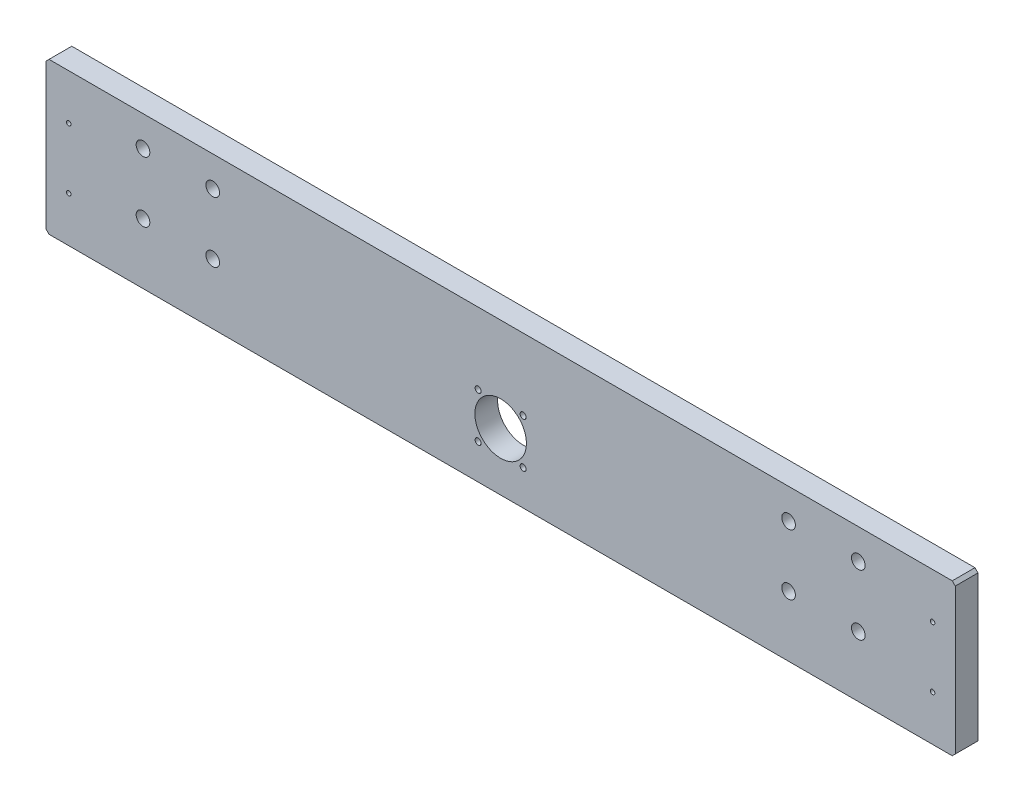
ISO-10303-21;
HEADER;
FILE_DESCRIPTION(('STEP AP214'),'2;1');
FILE_NAME('part.step','',(''),(''),'','','');
FILE_SCHEMA(('AUTOMOTIVE_DESIGN { 1 0 10303 214 1 1 1 1 }'));
ENDSEC;
DATA;
#1=APPLICATION_CONTEXT('core data for automotive mechanical design processes');
#2=APPLICATION_PROTOCOL_DEFINITION('international standard','automotive_design',2000,#1);
#3=PRODUCT_CONTEXT('',#1,'mechanical');
#4=PRODUCT('Part','Part','',(#3));
#5=PRODUCT_RELATED_PRODUCT_CATEGORY('part','',(#4));
#6=PRODUCT_DEFINITION_FORMATION('','',#4);
#7=PRODUCT_DEFINITION_CONTEXT('part definition',#1,'design');
#8=PRODUCT_DEFINITION('design','',#6,#7);
#9=PRODUCT_DEFINITION_SHAPE('','',#8);
#10=(LENGTH_UNIT() NAMED_UNIT(*) SI_UNIT(.MILLI.,.METRE.));
#11=(NAMED_UNIT(*) PLANE_ANGLE_UNIT() SI_UNIT($,.RADIAN.));
#12=(NAMED_UNIT(*) SI_UNIT($,.STERADIAN.) SOLID_ANGLE_UNIT());
#13=UNCERTAINTY_MEASURE_WITH_UNIT(LENGTH_MEASURE(1.E-05),#10,'distance_accuracy_value','');
#14=(GEOMETRIC_REPRESENTATION_CONTEXT(3) GLOBAL_UNCERTAINTY_ASSIGNED_CONTEXT((#13)) GLOBAL_UNIT_ASSIGNED_CONTEXT((#10,
#11,#12)) REPRESENTATION_CONTEXT('',''));
#15=CARTESIAN_POINT('',(0.,0.,0.));
#16=DIRECTION('',(0.,0.,1.));
#17=DIRECTION('',(1.,0.,0.));
#18=AXIS2_PLACEMENT_3D('',#15,#16,#17);
#19=CARTESIAN_POINT('',(0.,98.,-15.));
#20=DIRECTION('',(-0.707106781186548,0.707106781186547,0.));
#21=DIRECTION('',(-0.707106781186547,-0.707106781186548,0.));
#22=AXIS2_PLACEMENT_3D('',#19,#20,#21);
#23=PLANE('',#22);
#24=DIRECTION('',(-0.707106781186547,-0.707106781186548,0.));
#25=VECTOR('',#24,1.);
#26=CARTESIAN_POINT('',(0.,98.,0.));
#27=LINE('',#26,#25);
#28=CARTESIAN_POINT('',(2.,100.,0.));
#29=VERTEX_POINT('',#28);
#30=CARTESIAN_POINT('',(0.,98.,0.));
#31=VERTEX_POINT('',#30);
#32=EDGE_CURVE('E133',#29,#31,#27,.T.);
#33=ORIENTED_EDGE('',*,*,#32,.F.);
#34=DIRECTION('',(0.,0.,1.));
#35=VECTOR('',#34,1.);
#36=CARTESIAN_POINT('',(2.,100.,-15.));
#37=LINE('',#36,#35);
#38=CARTESIAN_POINT('',(2.,100.,-15.));
#39=VERTEX_POINT('',#38);
#40=EDGE_CURVE('E11',#39,#29,#37,.T.);
#41=ORIENTED_EDGE('',*,*,#40,.F.);
#42=DIRECTION('',(-0.707106781186547,-0.707106781186548,0.));
#43=VECTOR('',#42,1.);
#44=CARTESIAN_POINT('',(0.,98.,-15.));
#45=LINE('',#44,#43);
#46=CARTESIAN_POINT('',(0.,98.,-15.));
#47=VERTEX_POINT('',#46);
#48=EDGE_CURVE('E154',#39,#47,#45,.T.);
#49=ORIENTED_EDGE('',*,*,#48,.T.);
#50=DIRECTION('',(0.,0.,1.));
#51=VECTOR('',#50,1.);
#52=CARTESIAN_POINT('',(0.,98.,-15.));
#53=LINE('',#52,#51);
#54=EDGE_CURVE('E36',#47,#31,#53,.T.);
#55=ORIENTED_EDGE('',*,*,#54,.T.);
#56=EDGE_LOOP('',(#33,#41,#49,#55));
#57=FACE_BOUND('',#56,.T.);
#58=ADVANCED_FACE('F33',(#57),#23,.T.);
#59=CARTESIAN_POINT('',(2.,100.,-15.));
#60=DIRECTION('',(0.,1.,0.));
#61=DIRECTION('',(-1.,0.,0.));
#62=AXIS2_PLACEMENT_3D('',#59,#60,#61);
#63=PLANE('',#62);
#64=DIRECTION('',(-1.,0.,0.));
#65=VECTOR('',#64,1.);
#66=CARTESIAN_POINT('',(2.,100.,0.));
#67=LINE('',#66,#65);
#68=CARTESIAN_POINT('',(598.,100.,0.));
#69=VERTEX_POINT('',#68);
#70=EDGE_CURVE('E152',#69,#29,#67,.T.);
#71=ORIENTED_EDGE('',*,*,#70,.F.);
#72=DIRECTION('',(0.,0.,1.));
#73=VECTOR('',#72,1.);
#74=CARTESIAN_POINT('',(598.,100.,-15.));
#75=LINE('',#74,#73);
#76=CARTESIAN_POINT('',(598.,100.,-15.));
#77=VERTEX_POINT('',#76);
#78=EDGE_CURVE('E42',#77,#69,#75,.T.);
#79=ORIENTED_EDGE('',*,*,#78,.F.);
#80=DIRECTION('',(-1.,0.,0.));
#81=VECTOR('',#80,1.);
#82=CARTESIAN_POINT('',(2.,100.,-15.));
#83=LINE('',#82,#81);
#84=EDGE_CURVE('E123',#77,#39,#83,.T.);
#85=ORIENTED_EDGE('',*,*,#84,.T.);
#86=ORIENTED_EDGE('',*,*,#40,.T.);
#87=EDGE_LOOP('',(#71,#79,#85,#86));
#88=FACE_BOUND('',#87,.T.);
#89=ADVANCED_FACE('F166',(#88),#63,.T.);
#90=CARTESIAN_POINT('',(598.,100.,-15.));
#91=DIRECTION('',(0.70710678118654,0.707106781186555,0.));
#92=DIRECTION('',(-0.707106781186555,0.70710678118654,0.));
#93=AXIS2_PLACEMENT_3D('',#90,#91,#92);
#94=PLANE('',#93);
#95=DIRECTION('',(-0.707106781186555,0.70710678118654,0.));
#96=VECTOR('',#95,1.);
#97=CARTESIAN_POINT('',(598.,100.,0.));
#98=LINE('',#97,#96);
#99=CARTESIAN_POINT('',(600.,98.,0.));
#100=VERTEX_POINT('',#99);
#101=EDGE_CURVE('E110',#100,#69,#98,.T.);
#102=ORIENTED_EDGE('',*,*,#101,.F.);
#103=DIRECTION('',(0.,0.,1.));
#104=VECTOR('',#103,1.);
#105=CARTESIAN_POINT('',(600.,98.,-15.));
#106=LINE('',#105,#104);
#107=CARTESIAN_POINT('',(600.,98.,-15.));
#108=VERTEX_POINT('',#107);
#109=EDGE_CURVE('E105',#108,#100,#106,.T.);
#110=ORIENTED_EDGE('',*,*,#109,.F.);
#111=DIRECTION('',(-0.707106781186555,0.70710678118654,0.));
#112=VECTOR('',#111,1.);
#113=CARTESIAN_POINT('',(598.,100.,-15.));
#114=LINE('',#113,#112);
#115=EDGE_CURVE('E108',#108,#77,#114,.T.);
#116=ORIENTED_EDGE('',*,*,#115,.T.);
#117=ORIENTED_EDGE('',*,*,#78,.T.);
#118=EDGE_LOOP('',(#102,#110,#116,#117));
#119=FACE_BOUND('',#118,.T.);
#120=ADVANCED_FACE('F107',(#119),#94,.T.);
#121=CARTESIAN_POINT('',(600.,2.,-15.));
#122=DIRECTION('',(1.,0.,0.));
#123=DIRECTION('',(0.,1.,0.));
#124=AXIS2_PLACEMENT_3D('',#121,#122,#123);
#125=PLANE('',#124);
#126=DIRECTION('',(0.,1.,0.));
#127=VECTOR('',#126,1.);
#128=CARTESIAN_POINT('',(600.,2.,0.));
#129=LINE('',#128,#127);
#130=CARTESIAN_POINT('',(600.,2.,0.));
#131=VERTEX_POINT('',#130);
#132=EDGE_CURVE('E149',#131,#100,#129,.T.);
#133=ORIENTED_EDGE('',*,*,#132,.F.);
#134=DIRECTION('',(0.,0.,1.));
#135=VECTOR('',#134,1.);
#136=CARTESIAN_POINT('',(600.,2.,-15.));
#137=LINE('',#136,#135);
#138=CARTESIAN_POINT('',(600.,2.,-15.));
#139=VERTEX_POINT('',#138);
#140=EDGE_CURVE('E115',#139,#131,#137,.T.);
#141=ORIENTED_EDGE('',*,*,#140,.F.);
#142=DIRECTION('',(0.,1.,0.));
#143=VECTOR('',#142,1.);
#144=CARTESIAN_POINT('',(600.,2.,-15.));
#145=LINE('',#144,#143);
#146=EDGE_CURVE('E121',#139,#108,#145,.T.);
#147=ORIENTED_EDGE('',*,*,#146,.T.);
#148=ORIENTED_EDGE('',*,*,#109,.T.);
#149=EDGE_LOOP('',(#133,#141,#147,#148));
#150=FACE_BOUND('',#149,.T.);
#151=ADVANCED_FACE('F125',(#150),#125,.T.);
#152=CARTESIAN_POINT('',(598.,0.,-15.));
#153=DIRECTION('',(0.707106781186547,-0.707106781186548,0.));
#154=DIRECTION('',(0.707106781186548,0.707106781186547,0.));
#155=AXIS2_PLACEMENT_3D('',#152,#153,#154);
#156=PLANE('',#155);
#157=DIRECTION('',(0.707106781186548,0.707106781186547,0.));
#158=VECTOR('',#157,1.);
#159=CARTESIAN_POINT('',(598.,0.,0.));
#160=LINE('',#159,#158);
#161=CARTESIAN_POINT('',(598.,0.,0.));
#162=VERTEX_POINT('',#161);
#163=EDGE_CURVE('E146',#162,#131,#160,.T.);
#164=ORIENTED_EDGE('',*,*,#163,.F.);
#165=DIRECTION('',(0.,0.,1.));
#166=VECTOR('',#165,1.);
#167=CARTESIAN_POINT('',(598.,0.,-15.));
#168=LINE('',#167,#166);
#169=CARTESIAN_POINT('',(598.,0.,-15.));
#170=VERTEX_POINT('',#169);
#171=EDGE_CURVE('E158',#170,#162,#168,.T.);
#172=ORIENTED_EDGE('',*,*,#171,.F.);
#173=DIRECTION('',(0.707106781186548,0.707106781186547,0.));
#174=VECTOR('',#173,1.);
#175=CARTESIAN_POINT('',(598.,0.,-15.));
#176=LINE('',#175,#174);
#177=EDGE_CURVE('E126',#170,#139,#176,.T.);
#178=ORIENTED_EDGE('',*,*,#177,.T.);
#179=ORIENTED_EDGE('',*,*,#140,.T.);
#180=EDGE_LOOP('',(#164,#172,#178,#179));
#181=FACE_BOUND('',#180,.T.);
#182=ADVANCED_FACE('F179',(#181),#156,.T.);
#183=CARTESIAN_POINT('',(2.,0.,-15.));
#184=DIRECTION('',(0.,-1.,0.));
#185=DIRECTION('',(0.,0.,-1.));
#186=AXIS2_PLACEMENT_3D('',#183,#184,#185);
#187=PLANE('',#186);
#188=CARTESIAN_POINT('',(30.,0.,-7.5));
#189=DIRECTION('',(0.,-1.,0.));
#190=DIRECTION('',(0.,0.,-1.));
#191=AXIS2_PLACEMENT_3D('',#188,#189,#190);
#192=CIRCLE('',#191,3.4);
#193=CARTESIAN_POINT('',(30.,0.,-10.9));
#194=VERTEX_POINT('',#193);
#195=EDGE_CURVE('E293',#194,#194,#192,.T.);
#196=ORIENTED_EDGE('',*,*,#195,.F.);
#197=EDGE_LOOP('',(#196));
#198=FACE_BOUND('',#197,.T.);
#199=CARTESIAN_POINT('',(570.,0.,-7.5));
#200=DIRECTION('',(0.,-1.,0.));
#201=DIRECTION('',(0.,0.,-1.));
#202=AXIS2_PLACEMENT_3D('',#199,#200,#201);
#203=CIRCLE('',#202,3.39999999999996);
#204=CARTESIAN_POINT('',(570.,0.,-10.9));
#205=VERTEX_POINT('',#204);
#206=EDGE_CURVE('E295',#205,#205,#203,.T.);
#207=ORIENTED_EDGE('',*,*,#206,.F.);
#208=EDGE_LOOP('',(#207));
#209=FACE_BOUND('',#208,.T.);
#210=DIRECTION('',(1.,0.,0.));
#211=VECTOR('',#210,1.);
#212=CARTESIAN_POINT('',(2.,0.,0.));
#213=LINE('',#212,#211);
#214=CARTESIAN_POINT('',(2.,0.,0.));
#215=VERTEX_POINT('',#214);
#216=EDGE_CURVE('E143',#215,#162,#213,.T.);
#217=ORIENTED_EDGE('',*,*,#216,.F.);
#218=DIRECTION('',(0.,0.,1.));
#219=VECTOR('',#218,1.);
#220=CARTESIAN_POINT('',(2.,0.,-15.));
#221=LINE('',#220,#219);
#222=CARTESIAN_POINT('',(2.,0.,-15.));
#223=VERTEX_POINT('',#222);
#224=EDGE_CURVE('E160',#223,#215,#221,.T.);
#225=ORIENTED_EDGE('',*,*,#224,.F.);
#226=DIRECTION('',(1.,0.,0.));
#227=VECTOR('',#226,1.);
#228=CARTESIAN_POINT('',(2.,0.,-15.));
#229=LINE('',#228,#227);
#230=EDGE_CURVE('E128',#223,#170,#229,.T.);
#231=ORIENTED_EDGE('',*,*,#230,.T.);
#232=ORIENTED_EDGE('',*,*,#171,.T.);
#233=EDGE_LOOP('',(#217,#225,#231,#232));
#234=FACE_BOUND('',#233,.T.);
#235=ADVANCED_FACE('F182',(#198,#209,#234),#187,.T.);
#236=CARTESIAN_POINT('',(2.,0.,-15.));
#237=DIRECTION('',(-0.707106781186547,-0.707106781186547,0.));
#238=DIRECTION('',(0.707106781186548,-0.707106781186548,0.));
#239=AXIS2_PLACEMENT_3D('',#236,#237,#238);
#240=PLANE('',#239);
#241=DIRECTION('',(0.707106781186548,-0.707106781186548,0.));
#242=VECTOR('',#241,1.);
#243=CARTESIAN_POINT('',(2.,0.,0.));
#244=LINE('',#243,#242);
#245=CARTESIAN_POINT('',(0.,2.,0.));
#246=VERTEX_POINT('',#245);
#247=EDGE_CURVE('E140',#246,#215,#244,.T.);
#248=ORIENTED_EDGE('',*,*,#247,.F.);
#249=DIRECTION('',(0.,0.,1.));
#250=VECTOR('',#249,1.);
#251=CARTESIAN_POINT('',(0.,2.,-15.));
#252=LINE('',#251,#250);
#253=CARTESIAN_POINT('',(0.,2.,-15.));
#254=VERTEX_POINT('',#253);
#255=EDGE_CURVE('E161',#254,#246,#252,.T.);
#256=ORIENTED_EDGE('',*,*,#255,.F.);
#257=DIRECTION('',(0.707106781186548,-0.707106781186548,0.));
#258=VECTOR('',#257,1.);
#259=CARTESIAN_POINT('',(2.,0.,-15.));
#260=LINE('',#259,#258);
#261=EDGE_CURVE('E406',#254,#223,#260,.T.);
#262=ORIENTED_EDGE('',*,*,#261,.T.);
#263=ORIENTED_EDGE('',*,*,#224,.T.);
#264=EDGE_LOOP('',(#248,#256,#262,#263));
#265=FACE_BOUND('',#264,.T.);
#266=ADVANCED_FACE('F186',(#265),#240,.T.);
#267=CARTESIAN_POINT('',(0.,2.,-15.));
#268=DIRECTION('',(-1.,0.,0.));
#269=DIRECTION('',(0.,0.,1.));
#270=AXIS2_PLACEMENT_3D('',#267,#268,#269);
#271=PLANE('',#270);
#272=DIRECTION('',(0.,-1.,0.));
#273=VECTOR('',#272,1.);
#274=CARTESIAN_POINT('',(0.,2.,0.));
#275=LINE('',#274,#273);
#276=EDGE_CURVE('E136',#31,#246,#275,.T.);
#277=ORIENTED_EDGE('',*,*,#276,.F.);
#278=ORIENTED_EDGE('',*,*,#54,.F.);
#279=DIRECTION('',(0.,-1.,0.));
#280=VECTOR('',#279,1.);
#281=CARTESIAN_POINT('',(0.,2.,-15.));
#282=LINE('',#281,#280);
#283=EDGE_CURVE('E404',#47,#254,#282,.T.);
#284=ORIENTED_EDGE('',*,*,#283,.T.);
#285=ORIENTED_EDGE('',*,*,#255,.T.);
#286=EDGE_LOOP('',(#277,#278,#284,#285));
#287=FACE_BOUND('',#286,.T.);
#288=ADVANCED_FACE('F163',(#287),#271,.T.);
#289=CARTESIAN_POINT('',(0.,0.,-15.));
#290=DIRECTION('',(0.,0.,-1.));
#291=DIRECTION('',(-1.,0.,0.));
#292=AXIS2_PLACEMENT_3D('',#289,#290,#291);
#293=PLANE('',#292);
#294=CARTESIAN_POINT('',(15.,69.9999999999999,-15.));
#295=DIRECTION('',(0.,0.,1.));
#296=DIRECTION('',(-1.,0.,0.));
#297=AXIS2_PLACEMENT_3D('',#294,#295,#296);
#298=CIRCLE('',#297,1.5);
#299=CARTESIAN_POINT('',(13.5,69.9999999999999,-15.));
#300=VERTEX_POINT('',#299);
#301=EDGE_CURVE('E304',#300,#300,#298,.T.);
#302=ORIENTED_EDGE('',*,*,#301,.T.);
#303=EDGE_LOOP('',(#302));
#304=FACE_BOUND('',#303,.T.);
#305=CARTESIAN_POINT('',(585.,69.9999999999999,-15.));
#306=DIRECTION('',(0.,0.,1.));
#307=DIRECTION('',(1.,0.,0.));
#308=AXIS2_PLACEMENT_3D('',#305,#306,#307);
#309=CIRCLE('',#308,1.50000000000008);
#310=CARTESIAN_POINT('',(586.5,69.9999999999999,-15.));
#311=VERTEX_POINT('',#310);
#312=EDGE_CURVE('E309',#311,#311,#309,.T.);
#313=ORIENTED_EDGE('',*,*,#312,.T.);
#314=EDGE_LOOP('',(#313));
#315=FACE_BOUND('',#314,.T.);
#316=CARTESIAN_POINT('',(285.150757595083,52.8492424049176,-15.));
#317=DIRECTION('',(0.,0.,1.));
#318=DIRECTION('',(1.,0.,0.));
#319=AXIS2_PLACEMENT_3D('',#316,#317,#318);
#320=CIRCLE('',#319,2.);
#321=CARTESIAN_POINT('',(287.150757595083,52.8492424049176,-15.));
#322=VERTEX_POINT('',#321);
#323=EDGE_CURVE('E315',#322,#322,#320,.T.);
#324=ORIENTED_EDGE('',*,*,#323,.T.);
#325=EDGE_LOOP('',(#324));
#326=FACE_BOUND('',#325,.T.);
#327=CARTESIAN_POINT('',(585.,30.0000000000001,-15.));
#328=DIRECTION('',(0.,0.,1.));
#329=DIRECTION('',(-1.,0.,0.));
#330=AXIS2_PLACEMENT_3D('',#327,#328,#329);
#331=CIRCLE('',#330,1.50000000000008);
#332=CARTESIAN_POINT('',(583.5,30.0000000000001,-15.));
#333=VERTEX_POINT('',#332);
#334=EDGE_CURVE('E321',#333,#333,#331,.T.);
#335=ORIENTED_EDGE('',*,*,#334,.T.);
#336=EDGE_LOOP('',(#335));
#337=FACE_BOUND('',#336,.T.);
#338=CARTESIAN_POINT('',(15.,30.,-15.));
#339=DIRECTION('',(0.,0.,1.));
#340=DIRECTION('',(1.,0.,0.));
#341=AXIS2_PLACEMENT_3D('',#338,#339,#340);
#342=CIRCLE('',#341,1.5);
#343=CARTESIAN_POINT('',(16.5,30.,-15.));
#344=VERTEX_POINT('',#343);
#345=EDGE_CURVE('E327',#344,#344,#342,.T.);
#346=ORIENTED_EDGE('',*,*,#345,.T.);
#347=EDGE_LOOP('',(#346));
#348=FACE_BOUND('',#347,.T.);
#349=CARTESIAN_POINT('',(536.,80.0000000000001,-15.));
#350=DIRECTION('',(0.,0.,1.));
#351=DIRECTION('',(-1.,0.,0.));
#352=AXIS2_PLACEMENT_3D('',#349,#350,#351);
#353=CIRCLE('',#352,4.49999999999991);
#354=CARTESIAN_POINT('',(531.5,80.0000000000001,-15.));
#355=VERTEX_POINT('',#354);
#356=EDGE_CURVE('E333',#355,#355,#353,.T.);
#357=ORIENTED_EDGE('',*,*,#356,.T.);
#358=EDGE_LOOP('',(#357));
#359=FACE_BOUND('',#358,.T.);
#360=CARTESIAN_POINT('',(490.,80.,-15.));
#361=DIRECTION('',(0.,0.,1.));
#362=DIRECTION('',(1.,0.,0.));
#363=AXIS2_PLACEMENT_3D('',#360,#361,#362);
#364=CIRCLE('',#363,4.50000000000002);
#365=CARTESIAN_POINT('',(494.5,80.,-15.));
#366=VERTEX_POINT('',#365);
#367=EDGE_CURVE('E339',#366,#366,#364,.T.);
#368=ORIENTED_EDGE('',*,*,#367,.T.);
#369=EDGE_LOOP('',(#368));
#370=FACE_BOUND('',#369,.T.);
#371=CARTESIAN_POINT('',(490.,40.,-15.));
#372=DIRECTION('',(0.,0.,1.));
#373=DIRECTION('',(1.,0.,0.));
#374=AXIS2_PLACEMENT_3D('',#371,#372,#373);
#375=CIRCLE('',#374,4.49999999999996);
#376=CARTESIAN_POINT('',(494.5,40.,-15.));
#377=VERTEX_POINT('',#376);
#378=EDGE_CURVE('E345',#377,#377,#375,.T.);
#379=ORIENTED_EDGE('',*,*,#378,.T.);
#380=EDGE_LOOP('',(#379));
#381=FACE_BOUND('',#380,.T.);
#382=CARTESIAN_POINT('',(536.,40.,-15.));
#383=DIRECTION('',(0.,0.,1.));
#384=DIRECTION('',(-1.,0.,0.));
#385=AXIS2_PLACEMENT_3D('',#382,#383,#384);
#386=CIRCLE('',#385,4.50000000000002);
#387=CARTESIAN_POINT('',(531.5,40.,-15.));
#388=VERTEX_POINT('',#387);
#389=EDGE_CURVE('E351',#388,#388,#386,.T.);
#390=ORIENTED_EDGE('',*,*,#389,.T.);
#391=EDGE_LOOP('',(#390));
#392=FACE_BOUND('',#391,.T.);
#393=CARTESIAN_POINT('',(64.,80.,-15.));
#394=DIRECTION('',(0.,0.,1.));
#395=DIRECTION('',(1.,0.,0.));
#396=AXIS2_PLACEMENT_3D('',#393,#394,#395);
#397=CIRCLE('',#396,4.50000000000001);
#398=CARTESIAN_POINT('',(68.5,80.,-15.));
#399=VERTEX_POINT('',#398);
#400=EDGE_CURVE('E357',#399,#399,#397,.T.);
#401=ORIENTED_EDGE('',*,*,#400,.T.);
#402=EDGE_LOOP('',(#401));
#403=FACE_BOUND('',#402,.T.);
#404=CARTESIAN_POINT('',(64.0000000000003,40.,-15.));
#405=DIRECTION('',(0.,0.,1.));
#406=DIRECTION('',(1.,0.,0.));
#407=AXIS2_PLACEMENT_3D('',#404,#405,#406);
#408=CIRCLE('',#407,4.49999999999999);
#409=CARTESIAN_POINT('',(68.5000000000003,40.,-15.));
#410=VERTEX_POINT('',#409);
#411=EDGE_CURVE('E363',#410,#410,#408,.T.);
#412=ORIENTED_EDGE('',*,*,#411,.T.);
#413=EDGE_LOOP('',(#412));
#414=FACE_BOUND('',#413,.T.);
#415=CARTESIAN_POINT('',(110.,80.,-15.));
#416=DIRECTION('',(0.,0.,1.));
#417=DIRECTION('',(-1.,0.,0.));
#418=AXIS2_PLACEMENT_3D('',#415,#416,#417);
#419=CIRCLE('',#418,4.50000000000001);
#420=CARTESIAN_POINT('',(105.5,80.,-15.));
#421=VERTEX_POINT('',#420);
#422=EDGE_CURVE('E369',#421,#421,#419,.T.);
#423=ORIENTED_EDGE('',*,*,#422,.T.);
#424=EDGE_LOOP('',(#423));
#425=FACE_BOUND('',#424,.T.);
#426=CARTESIAN_POINT('',(110.,40.,-15.));
#427=DIRECTION('',(0.,0.,1.));
#428=DIRECTION('',(-1.,0.,0.));
#429=AXIS2_PLACEMENT_3D('',#426,#427,#428);
#430=CIRCLE('',#429,4.49999999999999);
#431=CARTESIAN_POINT('',(105.5,40.,-15.));
#432=VERTEX_POINT('',#431);
#433=EDGE_CURVE('E375',#432,#432,#430,.T.);
#434=ORIENTED_EDGE('',*,*,#433,.T.);
#435=EDGE_LOOP('',(#434));
#436=FACE_BOUND('',#435,.T.);
#437=CARTESIAN_POINT('',(285.150757595083,23.1507575950824,-15.));
#438=DIRECTION('',(0.,0.,1.));
#439=DIRECTION('',(-1.,0.,0.));
#440=AXIS2_PLACEMENT_3D('',#437,#438,#439);
#441=CIRCLE('',#440,2.);
#442=CARTESIAN_POINT('',(283.150757595083,23.1507575950824,-15.));
#443=VERTEX_POINT('',#442);
#444=EDGE_CURVE('E381',#443,#443,#441,.T.);
#445=ORIENTED_EDGE('',*,*,#444,.T.);
#446=EDGE_LOOP('',(#445));
#447=FACE_BOUND('',#446,.T.);
#448=CARTESIAN_POINT('',(314.849242404917,23.1507575950824,-15.));
#449=DIRECTION('',(0.,0.,1.));
#450=DIRECTION('',(1.,0.,0.));
#451=AXIS2_PLACEMENT_3D('',#448,#449,#450);
#452=CIRCLE('',#451,2.);
#453=CARTESIAN_POINT('',(316.849242404917,23.1507575950824,-15.));
#454=VERTEX_POINT('',#453);
#455=EDGE_CURVE('E387',#454,#454,#452,.T.);
#456=ORIENTED_EDGE('',*,*,#455,.T.);
#457=EDGE_LOOP('',(#456));
#458=FACE_BOUND('',#457,.T.);
#459=CARTESIAN_POINT('',(314.849242404917,52.8492424049176,-15.));
#460=DIRECTION('',(0.,0.,1.));
#461=DIRECTION('',(-1.,0.,0.));
#462=AXIS2_PLACEMENT_3D('',#459,#460,#461);
#463=CIRCLE('',#462,2.);
#464=CARTESIAN_POINT('',(312.849242404917,52.8492424049176,-15.));
#465=VERTEX_POINT('',#464);
#466=EDGE_CURVE('E393',#465,#465,#463,.T.);
#467=ORIENTED_EDGE('',*,*,#466,.T.);
#468=EDGE_LOOP('',(#467));
#469=FACE_BOUND('',#468,.T.);
#470=CARTESIAN_POINT('',(300.,38.,-15.));
#471=DIRECTION('',(0.,0.,1.));
#472=DIRECTION('',(1.,0.,0.));
#473=AXIS2_PLACEMENT_3D('',#470,#471,#472);
#474=CIRCLE('',#473,17.);
#475=CARTESIAN_POINT('',(317.,38.,-15.));
#476=VERTEX_POINT('',#475);
#477=EDGE_CURVE('E137',#476,#476,#474,.T.);
#478=ORIENTED_EDGE('',*,*,#477,.T.);
#479=EDGE_LOOP('',(#478));
#480=FACE_BOUND('',#479,.T.);
#481=ORIENTED_EDGE('',*,*,#48,.F.);
#482=ORIENTED_EDGE('',*,*,#84,.F.);
#483=ORIENTED_EDGE('',*,*,#115,.F.);
#484=ORIENTED_EDGE('',*,*,#146,.F.);
#485=ORIENTED_EDGE('',*,*,#177,.F.);
#486=ORIENTED_EDGE('',*,*,#230,.F.);
#487=ORIENTED_EDGE('',*,*,#261,.F.);
#488=ORIENTED_EDGE('',*,*,#283,.F.);
#489=EDGE_LOOP('',(#481,#482,#483,#484,#485,#486,#487,#488));
#490=FACE_BOUND('',#489,.T.);
#491=ADVANCED_FACE('F119',(#304,#315,#326,#337,#348,#359,#370,#381,#392,#403,#414,#425,#436,
#447,#458,#469,#480,#490),#293,.T.);
#492=CARTESIAN_POINT('',(0.,0.,0.));
#493=DIRECTION('',(0.,0.,-1.));
#494=DIRECTION('',(-1.,0.,0.));
#495=AXIS2_PLACEMENT_3D('',#492,#493,#494);
#496=PLANE('',#495);
#497=CARTESIAN_POINT('',(15.,69.9999999999999,0.));
#498=DIRECTION('',(0.,0.,1.));
#499=DIRECTION('',(-1.,0.,0.));
#500=AXIS2_PLACEMENT_3D('',#497,#498,#499);
#501=CIRCLE('',#500,1.5);
#502=CARTESIAN_POINT('',(13.5,69.9999999999999,0.));
#503=VERTEX_POINT('',#502);
#504=EDGE_CURVE('E303',#503,#503,#501,.T.);
#505=ORIENTED_EDGE('',*,*,#504,.F.);
#506=EDGE_LOOP('',(#505));
#507=FACE_BOUND('',#506,.T.);
#508=CARTESIAN_POINT('',(585.,69.9999999999999,0.));
#509=DIRECTION('',(0.,0.,1.));
#510=DIRECTION('',(1.,0.,0.));
#511=AXIS2_PLACEMENT_3D('',#508,#509,#510);
#512=CIRCLE('',#511,1.50000000000008);
#513=CARTESIAN_POINT('',(586.5,69.9999999999999,0.));
#514=VERTEX_POINT('',#513);
#515=EDGE_CURVE('E306',#514,#514,#512,.T.);
#516=ORIENTED_EDGE('',*,*,#515,.F.);
#517=EDGE_LOOP('',(#516));
#518=FACE_BOUND('',#517,.T.);
#519=CARTESIAN_POINT('',(285.150757595083,52.8492424049176,0.));
#520=DIRECTION('',(0.,0.,1.));
#521=DIRECTION('',(1.,0.,0.));
#522=AXIS2_PLACEMENT_3D('',#519,#520,#521);
#523=CIRCLE('',#522,2.);
#524=CARTESIAN_POINT('',(287.150757595083,52.8492424049176,0.));
#525=VERTEX_POINT('',#524);
#526=EDGE_CURVE('E312',#525,#525,#523,.T.);
#527=ORIENTED_EDGE('',*,*,#526,.F.);
#528=EDGE_LOOP('',(#527));
#529=FACE_BOUND('',#528,.T.);
#530=CARTESIAN_POINT('',(585.,30.0000000000001,0.));
#531=DIRECTION('',(0.,0.,1.));
#532=DIRECTION('',(-1.,0.,0.));
#533=AXIS2_PLACEMENT_3D('',#530,#531,#532);
#534=CIRCLE('',#533,1.50000000000008);
#535=CARTESIAN_POINT('',(583.5,30.0000000000001,0.));
#536=VERTEX_POINT('',#535);
#537=EDGE_CURVE('E318',#536,#536,#534,.T.);
#538=ORIENTED_EDGE('',*,*,#537,.F.);
#539=EDGE_LOOP('',(#538));
#540=FACE_BOUND('',#539,.T.);
#541=CARTESIAN_POINT('',(15.,30.,0.));
#542=DIRECTION('',(0.,0.,1.));
#543=DIRECTION('',(1.,0.,0.));
#544=AXIS2_PLACEMENT_3D('',#541,#542,#543);
#545=CIRCLE('',#544,1.5);
#546=CARTESIAN_POINT('',(16.5,30.,0.));
#547=VERTEX_POINT('',#546);
#548=EDGE_CURVE('E324',#547,#547,#545,.T.);
#549=ORIENTED_EDGE('',*,*,#548,.F.);
#550=EDGE_LOOP('',(#549));
#551=FACE_BOUND('',#550,.T.);
#552=CARTESIAN_POINT('',(536.,80.0000000000001,0.));
#553=DIRECTION('',(0.,0.,1.));
#554=DIRECTION('',(-1.,0.,0.));
#555=AXIS2_PLACEMENT_3D('',#552,#553,#554);
#556=CIRCLE('',#555,4.49999999999991);
#557=CARTESIAN_POINT('',(531.5,80.0000000000001,0.));
#558=VERTEX_POINT('',#557);
#559=EDGE_CURVE('E330',#558,#558,#556,.T.);
#560=ORIENTED_EDGE('',*,*,#559,.F.);
#561=EDGE_LOOP('',(#560));
#562=FACE_BOUND('',#561,.T.);
#563=CARTESIAN_POINT('',(490.,80.,0.));
#564=DIRECTION('',(0.,0.,1.));
#565=DIRECTION('',(1.,0.,0.));
#566=AXIS2_PLACEMENT_3D('',#563,#564,#565);
#567=CIRCLE('',#566,4.50000000000002);
#568=CARTESIAN_POINT('',(494.5,80.,0.));
#569=VERTEX_POINT('',#568);
#570=EDGE_CURVE('E336',#569,#569,#567,.T.);
#571=ORIENTED_EDGE('',*,*,#570,.F.);
#572=EDGE_LOOP('',(#571));
#573=FACE_BOUND('',#572,.T.);
#574=CARTESIAN_POINT('',(490.,40.,0.));
#575=DIRECTION('',(0.,0.,1.));
#576=DIRECTION('',(1.,0.,0.));
#577=AXIS2_PLACEMENT_3D('',#574,#575,#576);
#578=CIRCLE('',#577,4.49999999999996);
#579=CARTESIAN_POINT('',(494.5,40.,0.));
#580=VERTEX_POINT('',#579);
#581=EDGE_CURVE('E342',#580,#580,#578,.T.);
#582=ORIENTED_EDGE('',*,*,#581,.F.);
#583=EDGE_LOOP('',(#582));
#584=FACE_BOUND('',#583,.T.);
#585=CARTESIAN_POINT('',(536.,40.,0.));
#586=DIRECTION('',(0.,0.,1.));
#587=DIRECTION('',(-1.,0.,0.));
#588=AXIS2_PLACEMENT_3D('',#585,#586,#587);
#589=CIRCLE('',#588,4.50000000000002);
#590=CARTESIAN_POINT('',(531.5,40.,0.));
#591=VERTEX_POINT('',#590);
#592=EDGE_CURVE('E348',#591,#591,#589,.T.);
#593=ORIENTED_EDGE('',*,*,#592,.F.);
#594=EDGE_LOOP('',(#593));
#595=FACE_BOUND('',#594,.T.);
#596=CARTESIAN_POINT('',(64.,80.,0.));
#597=DIRECTION('',(0.,0.,1.));
#598=DIRECTION('',(1.,0.,0.));
#599=AXIS2_PLACEMENT_3D('',#596,#597,#598);
#600=CIRCLE('',#599,4.50000000000001);
#601=CARTESIAN_POINT('',(68.5,80.,0.));
#602=VERTEX_POINT('',#601);
#603=EDGE_CURVE('E354',#602,#602,#600,.T.);
#604=ORIENTED_EDGE('',*,*,#603,.F.);
#605=EDGE_LOOP('',(#604));
#606=FACE_BOUND('',#605,.T.);
#607=CARTESIAN_POINT('',(64.0000000000003,40.,0.));
#608=DIRECTION('',(0.,0.,1.));
#609=DIRECTION('',(1.,0.,0.));
#610=AXIS2_PLACEMENT_3D('',#607,#608,#609);
#611=CIRCLE('',#610,4.49999999999999);
#612=CARTESIAN_POINT('',(68.5000000000003,40.,0.));
#613=VERTEX_POINT('',#612);
#614=EDGE_CURVE('E360',#613,#613,#611,.T.);
#615=ORIENTED_EDGE('',*,*,#614,.F.);
#616=EDGE_LOOP('',(#615));
#617=FACE_BOUND('',#616,.T.);
#618=CARTESIAN_POINT('',(110.,80.,0.));
#619=DIRECTION('',(0.,0.,1.));
#620=DIRECTION('',(-1.,0.,0.));
#621=AXIS2_PLACEMENT_3D('',#618,#619,#620);
#622=CIRCLE('',#621,4.50000000000001);
#623=CARTESIAN_POINT('',(105.5,80.,0.));
#624=VERTEX_POINT('',#623);
#625=EDGE_CURVE('E366',#624,#624,#622,.T.);
#626=ORIENTED_EDGE('',*,*,#625,.F.);
#627=EDGE_LOOP('',(#626));
#628=FACE_BOUND('',#627,.T.);
#629=CARTESIAN_POINT('',(110.,40.,0.));
#630=DIRECTION('',(0.,0.,1.));
#631=DIRECTION('',(-1.,0.,0.));
#632=AXIS2_PLACEMENT_3D('',#629,#630,#631);
#633=CIRCLE('',#632,4.49999999999999);
#634=CARTESIAN_POINT('',(105.5,40.,0.));
#635=VERTEX_POINT('',#634);
#636=EDGE_CURVE('E372',#635,#635,#633,.T.);
#637=ORIENTED_EDGE('',*,*,#636,.F.);
#638=EDGE_LOOP('',(#637));
#639=FACE_BOUND('',#638,.T.);
#640=CARTESIAN_POINT('',(285.150757595083,23.1507575950824,0.));
#641=DIRECTION('',(0.,0.,1.));
#642=DIRECTION('',(-1.,0.,0.));
#643=AXIS2_PLACEMENT_3D('',#640,#641,#642);
#644=CIRCLE('',#643,2.);
#645=CARTESIAN_POINT('',(283.150757595083,23.1507575950824,0.));
#646=VERTEX_POINT('',#645);
#647=EDGE_CURVE('E378',#646,#646,#644,.T.);
#648=ORIENTED_EDGE('',*,*,#647,.F.);
#649=EDGE_LOOP('',(#648));
#650=FACE_BOUND('',#649,.T.);
#651=CARTESIAN_POINT('',(314.849242404917,23.1507575950824,0.));
#652=DIRECTION('',(0.,0.,1.));
#653=DIRECTION('',(1.,0.,0.));
#654=AXIS2_PLACEMENT_3D('',#651,#652,#653);
#655=CIRCLE('',#654,2.);
#656=CARTESIAN_POINT('',(316.849242404917,23.1507575950824,0.));
#657=VERTEX_POINT('',#656);
#658=EDGE_CURVE('E384',#657,#657,#655,.T.);
#659=ORIENTED_EDGE('',*,*,#658,.F.);
#660=EDGE_LOOP('',(#659));
#661=FACE_BOUND('',#660,.T.);
#662=CARTESIAN_POINT('',(314.849242404917,52.8492424049176,0.));
#663=DIRECTION('',(0.,0.,1.));
#664=DIRECTION('',(-1.,0.,0.));
#665=AXIS2_PLACEMENT_3D('',#662,#663,#664);
#666=CIRCLE('',#665,2.);
#667=CARTESIAN_POINT('',(312.849242404917,52.8492424049176,0.));
#668=VERTEX_POINT('',#667);
#669=EDGE_CURVE('E390',#668,#668,#666,.T.);
#670=ORIENTED_EDGE('',*,*,#669,.F.);
#671=EDGE_LOOP('',(#670));
#672=FACE_BOUND('',#671,.T.);
#673=CARTESIAN_POINT('',(300.,38.,0.));
#674=DIRECTION('',(0.,0.,1.));
#675=DIRECTION('',(1.,0.,0.));
#676=AXIS2_PLACEMENT_3D('',#673,#674,#675);
#677=CIRCLE('',#676,17.);
#678=CARTESIAN_POINT('',(317.,38.,0.));
#679=VERTEX_POINT('',#678);
#680=EDGE_CURVE('E396',#679,#679,#677,.T.);
#681=ORIENTED_EDGE('',*,*,#680,.F.);
#682=EDGE_LOOP('',(#681));
#683=FACE_BOUND('',#682,.T.);
#684=ORIENTED_EDGE('',*,*,#32,.T.);
#685=ORIENTED_EDGE('',*,*,#276,.T.);
#686=ORIENTED_EDGE('',*,*,#247,.T.);
#687=ORIENTED_EDGE('',*,*,#216,.T.);
#688=ORIENTED_EDGE('',*,*,#163,.T.);
#689=ORIENTED_EDGE('',*,*,#132,.T.);
#690=ORIENTED_EDGE('',*,*,#101,.T.);
#691=ORIENTED_EDGE('',*,*,#70,.T.);
#692=EDGE_LOOP('',(#684,#685,#686,#687,#688,#689,#690,#691));
#693=FACE_BOUND('',#692,.T.);
#694=ADVANCED_FACE('F165',(#507,#518,#529,#540,#551,#562,#573,#584,#595,#606,#617,#628,#639,
#650,#661,#672,#683,#693),#496,.F.);
#695=CARTESIAN_POINT('',(300.,38.,-15.));
#696=DIRECTION('',(0.,0.,1.));
#697=DIRECTION('',(1.,0.,0.));
#698=AXIS2_PLACEMENT_3D('',#695,#696,#697);
#699=CYLINDRICAL_SURFACE('',#698,17.);
#700=ORIENTED_EDGE('',*,*,#477,.F.);
#701=EDGE_LOOP('',(#700));
#702=FACE_BOUND('',#701,.T.);
#703=ORIENTED_EDGE('',*,*,#680,.T.);
#704=EDGE_LOOP('',(#703));
#705=FACE_BOUND('',#704,.T.);
#706=ADVANCED_FACE('F198',(#702,#705),#699,.F.);
#707=CARTESIAN_POINT('',(314.849242404917,52.8492424049176,-15.));
#708=DIRECTION('',(0.,0.,1.));
#709=DIRECTION('',(1.,0.,0.));
#710=AXIS2_PLACEMENT_3D('',#707,#708,#709);
#711=CYLINDRICAL_SURFACE('',#710,2.);
#712=ORIENTED_EDGE('',*,*,#466,.F.);
#713=EDGE_LOOP('',(#712));
#714=FACE_BOUND('',#713,.T.);
#715=ORIENTED_EDGE('',*,*,#669,.T.);
#716=EDGE_LOOP('',(#715));
#717=FACE_BOUND('',#716,.T.);
#718=ADVANCED_FACE('F205',(#714,#717),#711,.F.);
#719=CARTESIAN_POINT('',(314.849242404917,23.1507575950824,-15.));
#720=DIRECTION('',(0.,0.,1.));
#721=DIRECTION('',(1.,0.,0.));
#722=AXIS2_PLACEMENT_3D('',#719,#720,#721);
#723=CYLINDRICAL_SURFACE('',#722,2.);
#724=ORIENTED_EDGE('',*,*,#455,.F.);
#725=EDGE_LOOP('',(#724));
#726=FACE_BOUND('',#725,.T.);
#727=ORIENTED_EDGE('',*,*,#658,.T.);
#728=EDGE_LOOP('',(#727));
#729=FACE_BOUND('',#728,.T.);
#730=ADVANCED_FACE('F209',(#726,#729),#723,.F.);
#731=CARTESIAN_POINT('',(285.150757595083,23.1507575950824,-15.));
#732=DIRECTION('',(0.,0.,1.));
#733=DIRECTION('',(1.,0.,0.));
#734=AXIS2_PLACEMENT_3D('',#731,#732,#733);
#735=CYLINDRICAL_SURFACE('',#734,2.);
#736=ORIENTED_EDGE('',*,*,#444,.F.);
#737=EDGE_LOOP('',(#736));
#738=FACE_BOUND('',#737,.T.);
#739=ORIENTED_EDGE('',*,*,#647,.T.);
#740=EDGE_LOOP('',(#739));
#741=FACE_BOUND('',#740,.T.);
#742=ADVANCED_FACE('F213',(#738,#741),#735,.F.);
#743=CARTESIAN_POINT('',(110.,40.,-15.));
#744=DIRECTION('',(0.,0.,1.));
#745=DIRECTION('',(1.,0.,0.));
#746=AXIS2_PLACEMENT_3D('',#743,#744,#745);
#747=CYLINDRICAL_SURFACE('',#746,4.49999999999999);
#748=ORIENTED_EDGE('',*,*,#433,.F.);
#749=EDGE_LOOP('',(#748));
#750=FACE_BOUND('',#749,.T.);
#751=ORIENTED_EDGE('',*,*,#636,.T.);
#752=EDGE_LOOP('',(#751));
#753=FACE_BOUND('',#752,.T.);
#754=ADVANCED_FACE('F217',(#750,#753),#747,.F.);
#755=CARTESIAN_POINT('',(110.,80.,-15.));
#756=DIRECTION('',(0.,0.,1.));
#757=DIRECTION('',(1.,0.,0.));
#758=AXIS2_PLACEMENT_3D('',#755,#756,#757);
#759=CYLINDRICAL_SURFACE('',#758,4.50000000000001);
#760=ORIENTED_EDGE('',*,*,#422,.F.);
#761=EDGE_LOOP('',(#760));
#762=FACE_BOUND('',#761,.T.);
#763=ORIENTED_EDGE('',*,*,#625,.T.);
#764=EDGE_LOOP('',(#763));
#765=FACE_BOUND('',#764,.T.);
#766=ADVANCED_FACE('F221',(#762,#765),#759,.F.);
#767=CARTESIAN_POINT('',(64.0000000000003,40.,-15.));
#768=DIRECTION('',(0.,0.,1.));
#769=DIRECTION('',(1.,0.,0.));
#770=AXIS2_PLACEMENT_3D('',#767,#768,#769);
#771=CYLINDRICAL_SURFACE('',#770,4.49999999999999);
#772=ORIENTED_EDGE('',*,*,#411,.F.);
#773=EDGE_LOOP('',(#772));
#774=FACE_BOUND('',#773,.T.);
#775=ORIENTED_EDGE('',*,*,#614,.T.);
#776=EDGE_LOOP('',(#775));
#777=FACE_BOUND('',#776,.T.);
#778=ADVANCED_FACE('F225',(#774,#777),#771,.F.);
#779=CARTESIAN_POINT('',(64.,80.,-15.));
#780=DIRECTION('',(0.,0.,1.));
#781=DIRECTION('',(1.,0.,0.));
#782=AXIS2_PLACEMENT_3D('',#779,#780,#781);
#783=CYLINDRICAL_SURFACE('',#782,4.50000000000001);
#784=ORIENTED_EDGE('',*,*,#400,.F.);
#785=EDGE_LOOP('',(#784));
#786=FACE_BOUND('',#785,.T.);
#787=ORIENTED_EDGE('',*,*,#603,.T.);
#788=EDGE_LOOP('',(#787));
#789=FACE_BOUND('',#788,.T.);
#790=ADVANCED_FACE('F229',(#786,#789),#783,.F.);
#791=CARTESIAN_POINT('',(536.,40.,-15.));
#792=DIRECTION('',(0.,0.,1.));
#793=DIRECTION('',(1.,0.,0.));
#794=AXIS2_PLACEMENT_3D('',#791,#792,#793);
#795=CYLINDRICAL_SURFACE('',#794,4.50000000000002);
#796=ORIENTED_EDGE('',*,*,#389,.F.);
#797=EDGE_LOOP('',(#796));
#798=FACE_BOUND('',#797,.T.);
#799=ORIENTED_EDGE('',*,*,#592,.T.);
#800=EDGE_LOOP('',(#799));
#801=FACE_BOUND('',#800,.T.);
#802=ADVANCED_FACE('F233',(#798,#801),#795,.F.);
#803=CARTESIAN_POINT('',(490.,40.,-15.));
#804=DIRECTION('',(0.,0.,1.));
#805=DIRECTION('',(1.,0.,0.));
#806=AXIS2_PLACEMENT_3D('',#803,#804,#805);
#807=CYLINDRICAL_SURFACE('',#806,4.49999999999996);
#808=ORIENTED_EDGE('',*,*,#378,.F.);
#809=EDGE_LOOP('',(#808));
#810=FACE_BOUND('',#809,.T.);
#811=ORIENTED_EDGE('',*,*,#581,.T.);
#812=EDGE_LOOP('',(#811));
#813=FACE_BOUND('',#812,.T.);
#814=ADVANCED_FACE('F237',(#810,#813),#807,.F.);
#815=CARTESIAN_POINT('',(490.,80.,-15.));
#816=DIRECTION('',(0.,0.,1.));
#817=DIRECTION('',(1.,0.,0.));
#818=AXIS2_PLACEMENT_3D('',#815,#816,#817);
#819=CYLINDRICAL_SURFACE('',#818,4.50000000000002);
#820=ORIENTED_EDGE('',*,*,#367,.F.);
#821=EDGE_LOOP('',(#820));
#822=FACE_BOUND('',#821,.T.);
#823=ORIENTED_EDGE('',*,*,#570,.T.);
#824=EDGE_LOOP('',(#823));
#825=FACE_BOUND('',#824,.T.);
#826=ADVANCED_FACE('F241',(#822,#825),#819,.F.);
#827=CARTESIAN_POINT('',(536.,80.0000000000001,-15.));
#828=DIRECTION('',(0.,0.,1.));
#829=DIRECTION('',(1.,0.,0.));
#830=AXIS2_PLACEMENT_3D('',#827,#828,#829);
#831=CYLINDRICAL_SURFACE('',#830,4.49999999999991);
#832=ORIENTED_EDGE('',*,*,#356,.F.);
#833=EDGE_LOOP('',(#832));
#834=FACE_BOUND('',#833,.T.);
#835=ORIENTED_EDGE('',*,*,#559,.T.);
#836=EDGE_LOOP('',(#835));
#837=FACE_BOUND('',#836,.T.);
#838=ADVANCED_FACE('F245',(#834,#837),#831,.F.);
#839=CARTESIAN_POINT('',(15.,30.,-15.));
#840=DIRECTION('',(0.,0.,1.));
#841=DIRECTION('',(1.,0.,0.));
#842=AXIS2_PLACEMENT_3D('',#839,#840,#841);
#843=CYLINDRICAL_SURFACE('',#842,1.5);
#844=ORIENTED_EDGE('',*,*,#345,.F.);
#845=EDGE_LOOP('',(#844));
#846=FACE_BOUND('',#845,.T.);
#847=ORIENTED_EDGE('',*,*,#548,.T.);
#848=EDGE_LOOP('',(#847));
#849=FACE_BOUND('',#848,.T.);
#850=ADVANCED_FACE('F249',(#846,#849),#843,.F.);
#851=CARTESIAN_POINT('',(585.,30.0000000000001,-15.));
#852=DIRECTION('',(0.,0.,1.));
#853=DIRECTION('',(1.,0.,0.));
#854=AXIS2_PLACEMENT_3D('',#851,#852,#853);
#855=CYLINDRICAL_SURFACE('',#854,1.50000000000008);
#856=ORIENTED_EDGE('',*,*,#334,.F.);
#857=EDGE_LOOP('',(#856));
#858=FACE_BOUND('',#857,.T.);
#859=ORIENTED_EDGE('',*,*,#537,.T.);
#860=EDGE_LOOP('',(#859));
#861=FACE_BOUND('',#860,.T.);
#862=ADVANCED_FACE('F253',(#858,#861),#855,.F.);
#863=CARTESIAN_POINT('',(285.150757595083,52.8492424049176,-15.));
#864=DIRECTION('',(0.,0.,1.));
#865=DIRECTION('',(1.,0.,0.));
#866=AXIS2_PLACEMENT_3D('',#863,#864,#865);
#867=CYLINDRICAL_SURFACE('',#866,2.);
#868=ORIENTED_EDGE('',*,*,#323,.F.);
#869=EDGE_LOOP('',(#868));
#870=FACE_BOUND('',#869,.T.);
#871=ORIENTED_EDGE('',*,*,#526,.T.);
#872=EDGE_LOOP('',(#871));
#873=FACE_BOUND('',#872,.T.);
#874=ADVANCED_FACE('F257',(#870,#873),#867,.F.);
#875=CARTESIAN_POINT('',(585.,69.9999999999999,-15.));
#876=DIRECTION('',(0.,0.,1.));
#877=DIRECTION('',(1.,0.,0.));
#878=AXIS2_PLACEMENT_3D('',#875,#876,#877);
#879=CYLINDRICAL_SURFACE('',#878,1.50000000000008);
#880=ORIENTED_EDGE('',*,*,#312,.F.);
#881=EDGE_LOOP('',(#880));
#882=FACE_BOUND('',#881,.T.);
#883=ORIENTED_EDGE('',*,*,#515,.T.);
#884=EDGE_LOOP('',(#883));
#885=FACE_BOUND('',#884,.T.);
#886=ADVANCED_FACE('F261',(#882,#885),#879,.F.);
#887=CARTESIAN_POINT('',(15.,69.9999999999999,-15.));
#888=DIRECTION('',(0.,0.,1.));
#889=DIRECTION('',(1.,0.,0.));
#890=AXIS2_PLACEMENT_3D('',#887,#888,#889);
#891=CYLINDRICAL_SURFACE('',#890,1.5);
#892=ORIENTED_EDGE('',*,*,#301,.F.);
#893=EDGE_LOOP('',(#892));
#894=FACE_BOUND('',#893,.T.);
#895=ORIENTED_EDGE('',*,*,#504,.T.);
#896=EDGE_LOOP('',(#895));
#897=FACE_BOUND('',#896,.T.);
#898=ADVANCED_FACE('F265',(#894,#897),#891,.F.);
#899=CARTESIAN_POINT('',(570.,23.75,-7.5));
#900=DIRECTION('',(0.,-1.,0.));
#901=DIRECTION('',(0.,0.,-1.));
#902=AXIS2_PLACEMENT_3D('',#899,#900,#901);
#903=CONICAL_SURFACE('',#902,3.39999999999996,1.02974425867665);
#904=CARTESIAN_POINT('',(570.,25.7929261046937,-7.5));
#905=VERTEX_POINT('',#904);
#906=VERTEX_LOOP('',#905);
#907=FACE_BOUND('',#906,.T.);
#908=CARTESIAN_POINT('',(570.,23.75,-7.5));
#909=DIRECTION('',(0.,-1.,0.));
#910=DIRECTION('',(0.,0.,-1.));
#911=AXIS2_PLACEMENT_3D('',#908,#909,#910);
#912=CIRCLE('',#911,3.39999999999996);
#913=CARTESIAN_POINT('',(570.,23.75,-10.9));
#914=VERTEX_POINT('',#913);
#915=EDGE_CURVE('E300',#914,#914,#912,.T.);
#916=ORIENTED_EDGE('',*,*,#915,.T.);
#917=EDGE_LOOP('',(#916));
#918=FACE_BOUND('',#917,.T.);
#919=ADVANCED_FACE('F269',(#907,#918),#903,.F.);
#920=CARTESIAN_POINT('',(570.,0.,-7.5));
#921=DIRECTION('',(0.,-1.,0.));
#922=DIRECTION('',(0.,0.,-1.));
#923=AXIS2_PLACEMENT_3D('',#920,#921,#922);
#924=CYLINDRICAL_SURFACE('',#923,3.39999999999996);
#925=ORIENTED_EDGE('',*,*,#915,.F.);
#926=EDGE_LOOP('',(#925));
#927=FACE_BOUND('',#926,.T.);
#928=ORIENTED_EDGE('',*,*,#206,.T.);
#929=EDGE_LOOP('',(#928));
#930=FACE_BOUND('',#929,.T.);
#931=ADVANCED_FACE('F273',(#927,#930),#924,.F.);
#932=CARTESIAN_POINT('',(30.,23.75,-7.5));
#933=DIRECTION('',(0.,-1.,0.));
#934=DIRECTION('',(0.,0.,-1.));
#935=AXIS2_PLACEMENT_3D('',#932,#933,#934);
#936=CONICAL_SURFACE('',#935,3.39999999999999,1.02974425867665);
#937=CARTESIAN_POINT('',(30.,25.7929261046937,-7.5));
#938=VERTEX_POINT('',#937);
#939=VERTEX_LOOP('',#938);
#940=FACE_BOUND('',#939,.T.);
#941=CARTESIAN_POINT('',(30.,23.75,-7.5));
#942=DIRECTION('',(0.,-1.,0.));
#943=DIRECTION('',(0.,0.,-1.));
#944=AXIS2_PLACEMENT_3D('',#941,#942,#943);
#945=CIRCLE('',#944,3.39999999999999);
#946=CARTESIAN_POINT('',(30.,23.75,-10.9));
#947=VERTEX_POINT('',#946);
#948=EDGE_CURVE('E290',#947,#947,#945,.T.);
#949=ORIENTED_EDGE('',*,*,#948,.T.);
#950=EDGE_LOOP('',(#949));
#951=FACE_BOUND('',#950,.T.);
#952=ADVANCED_FACE('F277',(#940,#951),#936,.F.);
#953=CARTESIAN_POINT('',(30.,0.,-7.5));
#954=DIRECTION('',(0.,-1.,0.));
#955=DIRECTION('',(0.,0.,-1.));
#956=AXIS2_PLACEMENT_3D('',#953,#954,#955);
#957=CYLINDRICAL_SURFACE('',#956,3.4);
#958=ORIENTED_EDGE('',*,*,#948,.F.);
#959=EDGE_LOOP('',(#958));
#960=FACE_BOUND('',#959,.T.);
#961=ORIENTED_EDGE('',*,*,#195,.T.);
#962=EDGE_LOOP('',(#961));
#963=FACE_BOUND('',#962,.T.);
#964=ADVANCED_FACE('F281',(#960,#963),#957,.F.);
#965=CLOSED_SHELL('',(#58,#89,#120,#151,#182,#235,#266,#288,#491,#694,#706,#718,#730,#742,#754,
#766,#778,#790,#802,#814,#826,#838,#850,#862,#874,#886,#898,#919,#931,#952,#964));
#966=MANIFOLD_SOLID_BREP('B2',#965);
#967=ADVANCED_BREP_SHAPE_REPRESENTATION('',(#18,#966),#14);
#968=SHAPE_DEFINITION_REPRESENTATION(#9,#967);
ENDSEC;
END-ISO-10303-21;
